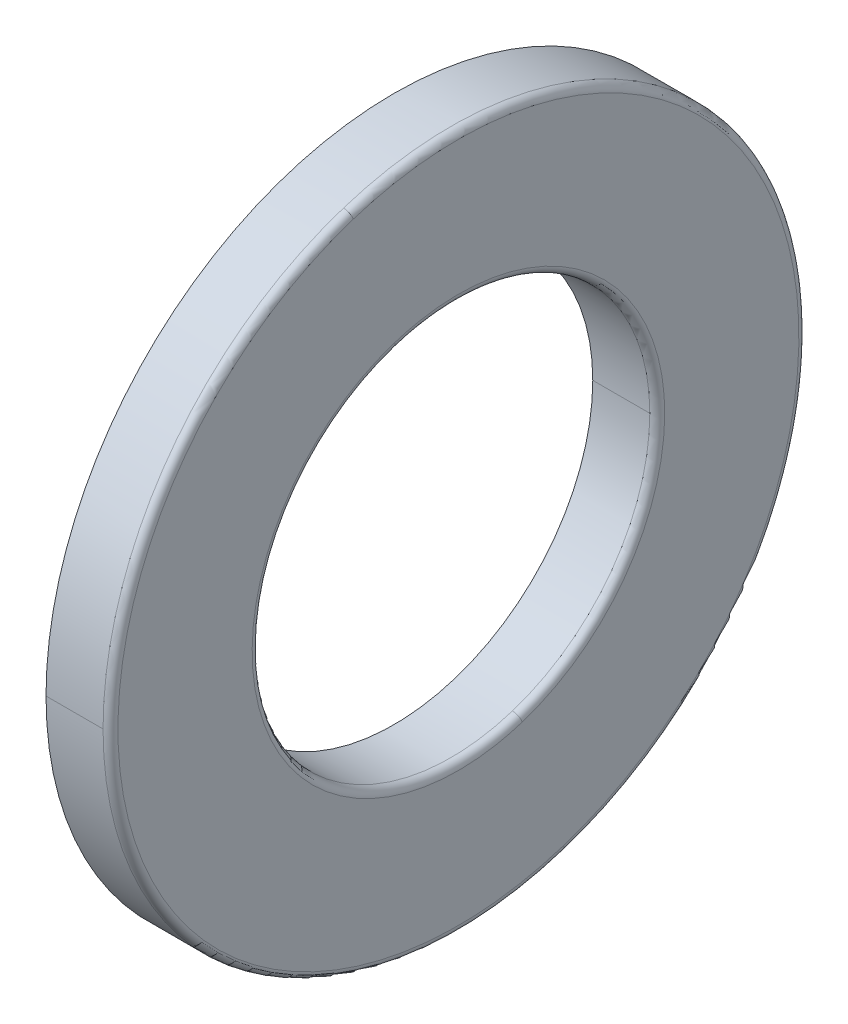
ISO-10303-21;
HEADER;
FILE_DESCRIPTION(('STEP AP214'),'2;1');
FILE_NAME('part.step','',(''),(''),'','','');
FILE_SCHEMA(('AUTOMOTIVE_DESIGN { 1 0 10303 214 1 1 1 1 }'));
ENDSEC;
DATA;
#1=APPLICATION_CONTEXT('core data for automotive mechanical design processes');
#2=APPLICATION_PROTOCOL_DEFINITION('international standard','automotive_design',2000,#1);
#3=PRODUCT_CONTEXT('',#1,'mechanical');
#4=PRODUCT('Part','Part','',(#3));
#5=PRODUCT_RELATED_PRODUCT_CATEGORY('part','',(#4));
#6=PRODUCT_DEFINITION_FORMATION('','',#4);
#7=PRODUCT_DEFINITION_CONTEXT('part definition',#1,'design');
#8=PRODUCT_DEFINITION('design','',#6,#7);
#9=PRODUCT_DEFINITION_SHAPE('','',#8);
#10=(LENGTH_UNIT() NAMED_UNIT(*) SI_UNIT(.MILLI.,.METRE.));
#11=(NAMED_UNIT(*) PLANE_ANGLE_UNIT() SI_UNIT($,.RADIAN.));
#12=(NAMED_UNIT(*) SI_UNIT($,.STERADIAN.) SOLID_ANGLE_UNIT());
#13=UNCERTAINTY_MEASURE_WITH_UNIT(LENGTH_MEASURE(1.E-05),#10,'distance_accuracy_value','');
#14=(GEOMETRIC_REPRESENTATION_CONTEXT(3) GLOBAL_UNCERTAINTY_ASSIGNED_CONTEXT((#13)) GLOBAL_UNIT_ASSIGNED_CONTEXT((#10,
#11,#12)) REPRESENTATION_CONTEXT('',''));
#15=CARTESIAN_POINT('',(0.,0.,0.));
#16=DIRECTION('',(0.,0.,1.));
#17=DIRECTION('',(1.,0.,0.));
#18=AXIS2_PLACEMENT_3D('',#15,#16,#17);
#19=CARTESIAN_POINT('',(4.5,0.,0.));
#20=DIRECTION('',(1.,0.,0.));
#21=DIRECTION('',(0.,-0.309016994374947,0.951056516295154));
#22=AXIS2_PLACEMENT_3D('',#19,#20,#21);
#23=TOROIDAL_SURFACE('',#22,10.75,2.381);
#24=CARTESIAN_POINT('',(4.5,-10.2238575501729,-3.32193268953068));
#25=DIRECTION('',(0.,0.309016994374947,-0.951056516295154));
#26=DIRECTION('',(0.800000000000001,0.57063390977709,0.185410196624968));
#27=AXIS2_PLACEMENT_3D('',#24,#25,#26);
#28=CIRCLE('',#27,2.381);
#29=CARTESIAN_POINT('',(6.4048,-8.86517821099365,-2.88047101136663));
#30=VERTEX_POINT('',#29);
#31=CARTESIAN_POINT('',(6.4048,-11.5825368893522,-3.76339436769473));
#32=VERTEX_POINT('',#31);
#33=EDGE_CURVE('E11',#30,#32,#28,.T.);
#34=ORIENTED_EDGE('',*,*,#33,.F.);
#35=CARTESIAN_POINT('',(6.4048,0.,0.));
#36=DIRECTION('',(1.,0.,0.));
#37=DIRECTION('',(0.,-0.951056516295154,-0.309016994374947));
#38=AXIS2_PLACEMENT_3D('',#35,#36,#37);
#39=CIRCLE('',#38,9.3214);
#40=CARTESIAN_POINT('',(6.4048,8.86517821099365,2.88047101136664));
#41=VERTEX_POINT('',#40);
#42=EDGE_CURVE('E25',#30,#41,#39,.T.);
#43=ORIENTED_EDGE('',*,*,#42,.T.);
#44=CARTESIAN_POINT('',(4.5,10.2238575501729,3.32193268953068));
#45=DIRECTION('',(0.,-0.309016994374948,0.951056516295154));
#46=DIRECTION('',(0.800000000000001,-0.57063390977709,-0.185410196624968));
#47=AXIS2_PLACEMENT_3D('',#44,#45,#46);
#48=CIRCLE('',#47,2.381);
#49=CARTESIAN_POINT('',(6.4048,11.5825368893522,3.76339436769473));
#50=VERTEX_POINT('',#49);
#51=EDGE_CURVE('E327',#41,#50,#48,.T.);
#52=ORIENTED_EDGE('',*,*,#51,.T.);
#53=CARTESIAN_POINT('',(6.4048,0.,0.));
#54=DIRECTION('',(1.,0.,0.));
#55=DIRECTION('',(0.,-0.951056516295154,-0.309016994374947));
#56=AXIS2_PLACEMENT_3D('',#53,#54,#55);
#57=CIRCLE('',#56,12.1786);
#58=EDGE_CURVE('E323',#32,#50,#57,.T.);
#59=ORIENTED_EDGE('',*,*,#58,.F.);
#60=EDGE_LOOP('',(#34,#43,#52,#59));
#61=FACE_BOUND('',#60,.T.);
#62=ADVANCED_FACE('F17',(#61),#23,.F.);
#63=CARTESIAN_POINT('',(6.4048,14.,0.));
#64=DIRECTION('',(-1.,0.,0.));
#65=DIRECTION('',(0.,0.,1.));
#66=AXIS2_PLACEMENT_3D('',#63,#64,#65);
#67=PLANE('',#66);
#68=ORIENTED_EDGE('',*,*,#58,.T.);
#69=CARTESIAN_POINT('',(6.4048,0.,0.));
#70=DIRECTION('',(1.,0.,0.));
#71=DIRECTION('',(0.,0.,-1.));
#72=AXIS2_PLACEMENT_3D('',#69,#70,#71);
#73=CIRCLE('',#72,12.1786);
#74=EDGE_CURVE('E318',#50,#32,#73,.T.);
#75=ORIENTED_EDGE('',*,*,#74,.T.);
#76=EDGE_LOOP('',(#68,#75));
#77=FACE_BOUND('',#76,.T.);
#78=CARTESIAN_POINT('',(6.4048,0.,0.));
#79=DIRECTION('',(1.,0.,0.));
#80=DIRECTION('',(0.,0.,-1.));
#81=AXIS2_PLACEMENT_3D('',#78,#79,#80);
#82=CIRCLE('',#81,14.);
#83=CARTESIAN_POINT('',(6.4048,0.,14.));
#84=VERTEX_POINT('',#83);
#85=CARTESIAN_POINT('',(6.4048,0.,-14.));
#86=VERTEX_POINT('',#85);
#87=EDGE_CURVE('E313',#84,#86,#82,.T.);
#88=ORIENTED_EDGE('',*,*,#87,.F.);
#89=CARTESIAN_POINT('',(6.4048,0.,0.));
#90=DIRECTION('',(1.,0.,0.));
#91=DIRECTION('',(0.,0.,-1.));
#92=AXIS2_PLACEMENT_3D('',#89,#90,#91);
#93=CIRCLE('',#92,14.);
#94=EDGE_CURVE('E308',#86,#84,#93,.T.);
#95=ORIENTED_EDGE('',*,*,#94,.F.);
#96=EDGE_LOOP('',(#88,#95));
#97=FACE_BOUND('',#96,.T.);
#98=ADVANCED_FACE('F233',(#77,#97),#67,.T.);
#99=CARTESIAN_POINT('',(8.7,0.,0.));
#100=DIRECTION('',(1.,0.,0.));
#101=DIRECTION('',(0.,-1.,0.));
#102=AXIS2_PLACEMENT_3D('',#99,#100,#101);
#103=CYLINDRICAL_SURFACE('',#102,14.);
#104=DIRECTION('',(1.,0.,0.));
#105=VECTOR('',#104,1.);
#106=CARTESIAN_POINT('',(6.4048,0.,14.));
#107=LINE('',#106,#105);
#108=CARTESIAN_POINT('',(8.7,0.,14.));
#109=VERTEX_POINT('',#108);
#110=EDGE_CURVE('E304',#84,#109,#107,.T.);
#111=ORIENTED_EDGE('',*,*,#110,.T.);
#112=CARTESIAN_POINT('',(8.7,0.,0.));
#113=DIRECTION('',(1.,0.,0.));
#114=DIRECTION('',(0.,0.,-1.));
#115=AXIS2_PLACEMENT_3D('',#112,#113,#114);
#116=CIRCLE('',#115,14.);
#117=CARTESIAN_POINT('',(8.7,13.3147912281321,4.32623792124926));
#118=VERTEX_POINT('',#117);
#119=EDGE_CURVE('E300',#118,#109,#116,.T.);
#120=ORIENTED_EDGE('',*,*,#119,.F.);
#121=CARTESIAN_POINT('',(8.7,0.,0.));
#122=DIRECTION('',(1.,0.,0.));
#123=DIRECTION('',(0.,0.,-1.));
#124=AXIS2_PLACEMENT_3D('',#121,#122,#123);
#125=CIRCLE('',#124,14.);
#126=CARTESIAN_POINT('',(8.7,0.,-14.));
#127=VERTEX_POINT('',#126);
#128=EDGE_CURVE('E296',#127,#118,#125,.T.);
#129=ORIENTED_EDGE('',*,*,#128,.F.);
#130=DIRECTION('',(1.,0.,0.));
#131=VECTOR('',#130,1.);
#132=CARTESIAN_POINT('',(6.4048,0.,-14.));
#133=LINE('',#132,#131);
#134=EDGE_CURVE('E291',#86,#127,#133,.T.);
#135=ORIENTED_EDGE('',*,*,#134,.F.);
#136=ORIENTED_EDGE('',*,*,#94,.T.);
#137=EDGE_LOOP('',(#111,#120,#129,#135,#136));
#138=FACE_BOUND('',#137,.T.);
#139=ADVANCED_FACE('F237',(#138),#103,.T.);
#140=CARTESIAN_POINT('',(8.7,0.,0.));
#141=DIRECTION('',(1.,0.,0.));
#142=DIRECTION('',(0.,1.,0.));
#143=AXIS2_PLACEMENT_3D('',#140,#141,#142);
#144=CYLINDRICAL_SURFACE('',#143,14.);
#145=ORIENTED_EDGE('',*,*,#110,.F.);
#146=ORIENTED_EDGE('',*,*,#87,.T.);
#147=ORIENTED_EDGE('',*,*,#134,.T.);
#148=CARTESIAN_POINT('',(8.7,0.,0.));
#149=DIRECTION('',(1.,0.,0.));
#150=DIRECTION('',(0.,0.,-1.));
#151=AXIS2_PLACEMENT_3D('',#148,#149,#150);
#152=CIRCLE('',#151,14.);
#153=CARTESIAN_POINT('',(8.7,-13.3147912281321,-4.32623792124926));
#154=VERTEX_POINT('',#153);
#155=EDGE_CURVE('E287',#154,#127,#152,.T.);
#156=ORIENTED_EDGE('',*,*,#155,.F.);
#157=CARTESIAN_POINT('',(8.7,0.,0.));
#158=DIRECTION('',(1.,0.,0.));
#159=DIRECTION('',(0.,0.,-1.));
#160=AXIS2_PLACEMENT_3D('',#157,#158,#159);
#161=CIRCLE('',#160,14.);
#162=EDGE_CURVE('E266',#109,#154,#161,.T.);
#163=ORIENTED_EDGE('',*,*,#162,.F.);
#164=EDGE_LOOP('',(#145,#146,#147,#156,#163));
#165=FACE_BOUND('',#164,.T.);
#166=ADVANCED_FACE('F242',(#165),#144,.T.);
#167=CARTESIAN_POINT('',(8.70000000000012,0.,0.));
#168=DIRECTION('',(1.,0.,0.));
#169=DIRECTION('',(0.,0.309016994374947,-0.951056516295154));
#170=AXIS2_PLACEMENT_3D('',#167,#168,#169);
#171=TOROIDAL_SURFACE('',#170,13.7000000000001,0.299999999999878);
#172=CARTESIAN_POINT('',(8.70000000000012,-13.0294742732437,-4.23353282293681));
#173=DIRECTION('',(0.,0.309016994374947,-0.951056516295154));
#174=DIRECTION('',(1.,0.,0.));
#175=AXIS2_PLACEMENT_3D('',#172,#173,#174);
#176=CIRCLE('',#175,0.299999999999878);
#177=CARTESIAN_POINT('',(9.,-13.0294742732437,-4.23353282293681));
#178=VERTEX_POINT('',#177);
#179=EDGE_CURVE('E259',#178,#154,#176,.T.);
#180=ORIENTED_EDGE('',*,*,#179,.F.);
#181=CARTESIAN_POINT('',(9.,0.,0.));
#182=DIRECTION('',(1.,0.,0.));
#183=DIRECTION('',(0.,0.,-1.));
#184=AXIS2_PLACEMENT_3D('',#181,#182,#183);
#185=CIRCLE('',#184,13.7);
#186=CARTESIAN_POINT('',(9.,13.0294742732437,4.23353282293682));
#187=VERTEX_POINT('',#186);
#188=EDGE_CURVE('E262',#187,#178,#185,.T.);
#189=ORIENTED_EDGE('',*,*,#188,.F.);
#190=CARTESIAN_POINT('',(8.70000000000012,13.0294742732437,4.23353282293682));
#191=DIRECTION('',(0.,-0.309016994374947,0.951056516295154));
#192=DIRECTION('',(1.,0.,0.));
#193=AXIS2_PLACEMENT_3D('',#190,#191,#192);
#194=CIRCLE('',#193,0.299999999999878);
#195=EDGE_CURVE('E271',#187,#118,#194,.T.);
#196=ORIENTED_EDGE('',*,*,#195,.T.);
#197=ORIENTED_EDGE('',*,*,#119,.T.);
#198=ORIENTED_EDGE('',*,*,#162,.T.);
#199=EDGE_LOOP('',(#180,#189,#196,#197,#198));
#200=FACE_BOUND('',#199,.T.);
#201=ADVANCED_FACE('F249',(#200),#171,.T.);
#202=CARTESIAN_POINT('',(8.70000000000012,0.,0.));
#203=DIRECTION('',(1.,0.,0.));
#204=DIRECTION('',(0.,-0.309016994374947,0.951056516295154));
#205=AXIS2_PLACEMENT_3D('',#202,#203,#204);
#206=TOROIDAL_SURFACE('',#205,13.7000000000001,0.299999999999878);
#207=ORIENTED_EDGE('',*,*,#179,.T.);
#208=ORIENTED_EDGE('',*,*,#155,.T.);
#209=ORIENTED_EDGE('',*,*,#128,.T.);
#210=ORIENTED_EDGE('',*,*,#195,.F.);
#211=CARTESIAN_POINT('',(9.,-13.0294742732436,-4.23353282293678));
#212=CARTESIAN_POINT('',(9.,-12.364445482672,-6.28017870572112));
#213=CARTESIAN_POINT('',(9.,-11.2977242279673,-8.19637060986403));
#214=CARTESIAN_POINT('',(9.,-9.86276560883806,-9.87640074180395));
#215=CARTESIAN_POINT('',(9.,-6.41146238160593,-12.5831986250358));
#216=CARTESIAN_POINT('',(9.,-2.19298901367726,-13.7843595336471));
#217=CARTESIAN_POINT('',(9.,0.00964202154805742,-13.9577141116845));
#218=CARTESIAN_POINT('',(9.,4.36407565946443,-13.431243812121));
#219=CARTESIAN_POINT('',(9.,8.19633795127018,-11.297695357048));
#220=CARTESIAN_POINT('',(9.,9.87640862671735,-9.86277451861592));
#221=CARTESIAN_POINT('',(9.,12.5832006039778,-6.41145849771348));
#222=CARTESIAN_POINT('',(9.,13.7843476908496,-2.19298787168432));
#223=CARTESIAN_POINT('',(9.,13.9577566649887,0.00963257009115726));
#224=CARTESIAN_POINT('',(9.,13.6944429464883,2.18686740684885));
#225=CARTESIAN_POINT('',(9.,13.0294742732436,4.23353282293678));
#226=B_SPLINE_CURVE_WITH_KNOTS('',5,(#211,#212,#213,#214,#215,#216,#217,#218,#219,#220,#221,
#222,#223,#224,#225),.UNSPECIFIED.,.F.,.F.,(6,3,3,3,6),(0.,0.785398163397448,1.5707963267949,
2.35619449019234,3.14159265358979),.UNSPECIFIED.);
#227=EDGE_CURVE('E205',#178,#187,#226,.T.);
#228=ORIENTED_EDGE('',*,*,#227,.F.);
#229=EDGE_LOOP('',(#207,#208,#209,#210,#228));
#230=FACE_BOUND('',#229,.T.);
#231=ADVANCED_FACE('F167',(#230),#206,.T.);
#232=CARTESIAN_POINT('',(9.,8.3,0.));
#233=DIRECTION('',(1.,0.,0.));
#234=DIRECTION('',(0.,0.,-1.));
#235=AXIS2_PLACEMENT_3D('',#232,#233,#234);
#236=PLANE('',#235);
#237=ORIENTED_EDGE('',*,*,#227,.T.);
#238=ORIENTED_EDGE('',*,*,#188,.T.);
#239=EDGE_LOOP('',(#237,#238));
#240=FACE_BOUND('',#239,.T.);
#241=CARTESIAN_POINT('',(9.,7.89376908524966,2.56484105331204));
#242=CARTESIAN_POINT('',(9.,7.85180466911084,2.69400356859346));
#243=CARTESIAN_POINT('',(9.,7.80666484656175,2.82213407404268));
#244=CARTESIAN_POINT('',(9.,7.71015497178767,3.07602688721217));
#245=CARTESIAN_POINT('',(9.,7.6587849195627,3.20178919493246));
#246=CARTESIAN_POINT('',(9.,7.54993516858153,3.45064143457961));
#247=CARTESIAN_POINT('',(9.,7.49245546982535,3.57373136650647));
#248=CARTESIAN_POINT('',(9.,7.3715257492948,3.81694264319222));
#249=CARTESIAN_POINT('',(9.,7.30807572752043,3.93706398795111));
#250=CARTESIAN_POINT('',(9.,7.17535798988778,4.17404862089825));
#251=CARTESIAN_POINT('',(9.,7.1060902740295,4.2909119090865));
#252=CARTESIAN_POINT('',(9.,6.96190408124258,4.52109891818925));
#253=CARTESIAN_POINT('',(9.,6.88698560431395,4.63442263910376));
#254=CARTESIAN_POINT('',(9.,6.73167835820937,4.85725750067449));
#255=CARTESIAN_POINT('',(9.,6.65128958903342,4.96676864133072));
#256=CARTESIAN_POINT('',(9.,6.48523542640134,5.1817145221203));
#257=CARTESIAN_POINT('',(9.,6.3995700329452,5.28714926225365));
#258=CARTESIAN_POINT('',(9.,6.22316899601511,5.49368834002727));
#259=CARTESIAN_POINT('',(9.,6.13243335254116,5.59479267766754));
#260=CARTESIAN_POINT('',(9.,5.9461104060026,5.79242738136951));
#261=CARTESIAN_POINT('',(9.,5.85052310293799,5.88895774743121));
#262=CARTESIAN_POINT('',(9.,5.65472711531939,6.07721195783709));
#263=CARTESIAN_POINT('',(9.,5.55451843076539,6.16893580218127));
#264=CARTESIAN_POINT('',(9.,5.34972109168892,6.3473559983856));
#265=CARTESIAN_POINT('',(9.,5.24513243716645,6.43405235024576));
#266=CARTESIAN_POINT('',(9.,5.03182712137662,6.60220870237443));
#267=CARTESIAN_POINT('',(9.,4.92311046010926,6.68366870264294));
#268=CARTESIAN_POINT('',(9.,4.70181103879071,6.84115610731321));
#269=CARTESIAN_POINT('',(9.,4.58922827873952,6.91718351171498));
#270=CARTESIAN_POINT('',(9.,4.36046788158294,7.06362256797519));
#271=CARTESIAN_POINT('',(9.,4.24429024447754,7.13403421983364));
#272=CARTESIAN_POINT('',(9.,4.00861997531639,7.26907214317059));
#273=CARTESIAN_POINT('',(9.,3.88912734326064,7.33369841464911));
#274=CARTESIAN_POINT('',(9.,3.64711495241571,7.4570098868776));
#275=CARTESIAN_POINT('',(9.,3.52459519362652,7.51569508762757));
#276=CARTESIAN_POINT('',(9.,3.27682371014511,7.62698304061018));
#277=CARTESIAN_POINT('',(9.,3.15157198545287,7.67958579284281));
#278=CARTESIAN_POINT('',(9.,2.89863831254091,7.77858212415312));
#279=CARTESIAN_POINT('',(9.,2.77095636432117,7.82497570323081));
#280=CARTESIAN_POINT('',(9.,2.51346984135106,7.91144192203565));
#281=CARTESIAN_POINT('',(9.,2.3836652666007,7.9515145617628));
#282=CARTESIAN_POINT('',(9.,2.12224620115945,8.02524236336752));
#283=CARTESIAN_POINT('',(9.,1.99063171046857,8.05889752524509));
#284=CARTESIAN_POINT('',(9.,1.72590988398243,8.11970929291783));
#285=CARTESIAN_POINT('',(9.,1.59280254818718,8.14686589871301));
#286=CARTESIAN_POINT('',(9.,1.32541569872305,8.19461513157897));
#287=CARTESIAN_POINT('',(9.,1.19113618505417,8.21520775864975));
#288=CARTESIAN_POINT('',(9.,0.921728470952734,8.24977942462461));
#289=CARTESIAN_POINT('',(9.,0.786600270520169,8.26375846352869));
#290=CARTESIAN_POINT('',(9.,0.515820718562019,8.285069276441));
#291=CARTESIAN_POINT('',(9.,0.380169367036435,8.29240105044923));
#292=CARTESIAN_POINT('',(9.,0.10867030887973,8.30039967068408));
#293=CARTESIAN_POINT('',(9.,-0.0271773977513924,8.3010665169107));
#294=CARTESIAN_POINT('',(9.,-0.298741897095047,8.29573367509134));
#295=CARTESIAN_POINT('',(9.,-0.434458689807579,8.28973398704537));
#296=CARTESIAN_POINT('',(9.,-0.705434407673021,8.27108253045485));
#297=CARTESIAN_POINT('',(9.,-0.840693332825931,8.25843076191031));
#298=CARTESIAN_POINT('',(9.,-1.11042746497415,8.22650562354123));
#299=CARTESIAN_POINT('',(9.,-1.24490267196947,8.2072322537167));
#300=CARTESIAN_POINT('',(9.,-1.51274540525021,8.16211034402371));
#301=CARTESIAN_POINT('',(9.,-1.64611293153563,8.13626180415525));
#302=CARTESIAN_POINT('',(9.,-1.91141900934417,8.078051825771));
#303=CARTESIAN_POINT('',(9.,-2.04335756086727,8.04569038725522));
#304=CARTESIAN_POINT('',(9.,-2.30548783762408,7.97453257311624));
#305=CARTESIAN_POINT('',(9.,-2.43567956285779,7.93573619749304));
#306=CARTESIAN_POINT('',(9.,-2.69400254376627,7.85180197300628));
#307=CARTESIAN_POINT('',(9.,-2.82213379944105,7.80666412414271));
#308=CARTESIAN_POINT('',(9.,-3.07602716181378,7.71015569420672));
#309=CARTESIAN_POINT('',(9.,-3.20178926851173,7.6587851131343));
#310=CARTESIAN_POINT('',(9.,-3.45064136100032,7.54993497500994));
#311=CARTESIAN_POINT('',(9.,-3.57373134679095,7.492455417958));
#312=CARTESIAN_POINT('',(9.,-3.81694266290772,7.37152580116216));
#313=CARTESIAN_POINT('',(9.,-3.93706399323385,7.30807574141825));
#314=CARTESIAN_POINT('',(9.,-4.17404861561548,7.17535797598997));
#315=CARTESIAN_POINT('',(9.,-4.29091190767098,7.1060902703056));
#316=CARTESIAN_POINT('',(9.,-4.52109891960475,6.9619040849665));
#317=CARTESIAN_POINT('',(9.,-4.63442263948303,6.88698560531178));
#318=CARTESIAN_POINT('',(9.,-4.8572575002952,6.73167835721156));
#319=CARTESIAN_POINT('',(9.,-4.96676864122909,6.65128958876606));
#320=CARTESIAN_POINT('',(9.,-5.18171452222192,6.48523542666871));
#321=CARTESIAN_POINT('',(9.,-5.28714926228087,6.39957003301685));
#322=CARTESIAN_POINT('',(9.,-5.49368834000003,6.22316899594348));
#323=CARTESIAN_POINT('',(9.,-5.59479267766024,6.13243335252197));
#324=CARTESIAN_POINT('',(9.,-5.7924273813768,5.9461104060218));
#325=CARTESIAN_POINT('',(9.,-5.88895774743316,5.85052310294314));
#326=CARTESIAN_POINT('',(9.,-6.07721195783512,5.65472711531425));
#327=CARTESIAN_POINT('',(9.,-6.16893580218073,5.55451843076402));
#328=CARTESIAN_POINT('',(9.,-6.34735599838612,5.34972109169031));
#329=CARTESIAN_POINT('',(9.,-6.4340523502459,5.24513243716684));
#330=CARTESIAN_POINT('',(9.,-6.60220870237428,5.03182712137627));
#331=CARTESIAN_POINT('',(9.,-6.68366870264289,4.92311046010917));
#332=CARTESIAN_POINT('',(9.,-6.84115610731324,4.70181103879082));
#333=CARTESIAN_POINT('',(9.,-6.91718351171498,4.58922827873956));
#334=CARTESIAN_POINT('',(9.,-7.06362256797517,4.36046788158292));
#335=CARTESIAN_POINT('',(9.,-7.13403421983363,4.24429024447754));
#336=CARTESIAN_POINT('',(9.,-7.26907214317059,4.00861997531641));
#337=CARTESIAN_POINT('',(9.,-7.33369841464911,3.88912734326065));
#338=CARTESIAN_POINT('',(9.,-7.45700988687759,3.64711495241572));
#339=CARTESIAN_POINT('',(9.,-7.51569508762756,3.52459519362653));
#340=CARTESIAN_POINT('',(9.,-7.62698304061018,3.27682371014512));
#341=CARTESIAN_POINT('',(9.,-7.67958579284283,3.15157198545288));
#342=CARTESIAN_POINT('',(9.,-7.77858212415309,2.89863831254093));
#343=CARTESIAN_POINT('',(9.,-7.8249757032307,2.77095636432121));
#344=CARTESIAN_POINT('',(9.,-7.91144192203575,2.51346984135105));
#345=CARTESIAN_POINT('',(9.,-7.95151456176318,2.38366526660061));
#346=CARTESIAN_POINT('',(9.,-8.02524236336714,2.12224620115956));
#347=CARTESIAN_POINT('',(9.,-8.05889752524366,1.99063171046897));
#348=CARTESIAN_POINT('',(9.,-8.11970929291925,1.72590988398206));
#349=CARTESIAN_POINT('',(9.,-8.14686589871831,1.59280254818575));
#350=CARTESIAN_POINT('',(9.,-8.19461513157365,1.3254156987245));
#351=CARTESIAN_POINT('',(9.,-8.21520775862993,1.19113618505957));
#352=CARTESIAN_POINT('',(9.,-8.24977942464443,0.921728470947369));
#353=CARTESIAN_POINT('',(9.,-8.26375846360265,0.786600270500105));
#354=CARTESIAN_POINT('',(9.,-8.28506927636704,0.515820718582113));
#355=CARTESIAN_POINT('',(9.,-8.29240105017319,0.380169367111384));
#356=CARTESIAN_POINT('',(9.,-8.30039967096012,0.108670308804811));
#357=CARTESIAN_POINT('',(9.,-8.30106651794089,-0.0271773980310325));
#358=CARTESIAN_POINT('',(9.,-8.29573367406115,-0.298741896815376));
#359=CARTESIAN_POINT('',(9.,-8.28973398320065,-0.434458688763876));
#360=CARTESIAN_POINT('',(9.,-8.27108253429957,-0.705434408716695));
#361=CARTESIAN_POINT('',(9.,-8.258430776259,-0.840693336721013));
#362=CARTESIAN_POINT('',(9.,-8.22650560919254,-1.11042746107905));
#363=CARTESIAN_POINT('',(9.,-8.20723220016665,-1.24490265743278));
#364=CARTESIAN_POINT('',(9.,-8.16211039757377,-1.51274541978688));
#365=CARTESIAN_POINT('',(9.,-8.13626200400678,-1.64611298578727));
#366=CARTESIAN_POINT('',(9.,-8.07805162591947,-1.91141895509251));
#367=CARTESIAN_POINT('',(9.,-8.04568964139916,-2.04335735839737));
#368=CARTESIAN_POINT('',(9.,-7.9745333189723,-2.30548804009395));
#369=CARTESIAN_POINT('',(9.,-7.93573898106576,-2.43568031848567));
#370=CARTESIAN_POINT('',(9.,-7.89376908524966,-2.56484105331202));
#371=B_SPLINE_CURVE_WITH_KNOTS('',3,(#241,#242,#243,#244,#245,#246,#247,#248,#249,#250,#251,
#252,#253,#254,#255,#256,#257,#258,#259,#260,#261,#262,#263,#264,#265,#266,#267,#268,#269,#270,
#271,#272,#273,#274,#275,#276,#277,#278,#279,#280,#281,#282,#283,#284,#285,#286,#287,#288,#289,
#290,#291,#292,#293,#294,#295,#296,#297,#298,#299,#300,#301,#302,#303,#304,#305,#306,#307,#308,
#309,#310,#311,#312,#313,#314,#315,#316,#317,#318,#319,#320,#321,#322,#323,#324,#325,#326,#327,
#328,#329,#330,#331,#332,#333,#334,#335,#336,#337,#338,#339,#340,#341,#342,#343,#344,#345,#346,
#347,#348,#349,#350,#351,#352,#353,#354,#355,#356,#357,#358,#359,#360,#361,#362,#363,#364,#365,
#366,#367,#368,#369,#370),.UNSPECIFIED.,.F.,.F.,(4,2,2,2,2,2,2,2,2,2,2,2,2,2,2,2,2,2,2,2,2,2,2,
2,2,2,2,2,2,2,2,2,2,2,2,2,2,2,2,2,2,2,2,2,2,2,2,2,2,2,2,2,2,2,2,2,2,2,2,2,2,2,2,2,4),(0.,
0.407384393480336,0.814768786960675,1.22215318044101,1.62953757392135,2.03692196740169,
2.44430636088203,2.85169075436236,3.2590751478427,3.66645954132304,4.07384393480338,
4.48122832828372,4.88861272176405,5.29599711524439,5.70338150872473,6.11076590220506,
6.5181502956854,6.92553468916574,7.33291908264608,7.74030347612642,8.14768786960676,
8.55507226308709,8.96245665656744,9.36984105004777,9.77722544352811,10.1846098370084,
10.5919942304888,10.9993786239691,11.4067630174495,11.8141474109298,12.2215318044101,
12.6289161978905,13.0363005913708,13.4436849848511,13.8510693783315,14.2584537718118,
14.6658381652922,15.0732225587725,15.4806069522528,15.8879913457332,16.2953757392135,
16.7027601326939,17.1101445261742,17.5175289196545,17.9249133131349,18.3322977066152,
18.7396821000955,19.1470664935759,19.5544508870562,19.9618352805365,20.3692196740169,
20.7766040674972,21.1839884609776,21.5913728544579,21.9987572479382,22.4061416414186,
22.8135260348989,23.2209104283792,23.6282948218596,24.0356792153399,24.4430636088203,
24.8504480023006,25.2578323957809,25.6652167892613,26.0726011827416),.UNSPECIFIED.);
#372=CARTESIAN_POINT('',(9.,7.89376908524966,2.56484105331203));
#373=VERTEX_POINT('',#372);
#374=CARTESIAN_POINT('',(9.,-7.89376908524966,-2.56484105331202));
#375=VERTEX_POINT('',#374);
#376=EDGE_CURVE('E201',#373,#375,#371,.T.);
#377=ORIENTED_EDGE('',*,*,#376,.F.);
#378=CARTESIAN_POINT('',(9.,-7.89376908524966,-2.56484105331204));
#379=CARTESIAN_POINT('',(9.,-7.85180466911084,-2.69400356859346));
#380=CARTESIAN_POINT('',(9.,-7.80666484656175,-2.82213407404267));
#381=CARTESIAN_POINT('',(9.,-7.71015497178767,-3.07602688721217));
#382=CARTESIAN_POINT('',(9.,-7.6587849195627,-3.20178919493246));
#383=CARTESIAN_POINT('',(9.,-7.54993516858153,-3.45064143457961));
#384=CARTESIAN_POINT('',(9.,-7.49245546982535,-3.57373136650647));
#385=CARTESIAN_POINT('',(9.,-7.3715257492948,-3.81694264319222));
#386=CARTESIAN_POINT('',(9.,-7.30807572752043,-3.93706398795111));
#387=CARTESIAN_POINT('',(9.,-7.17535798988778,-4.17404862089825));
#388=CARTESIAN_POINT('',(9.,-7.1060902740295,-4.2909119090865));
#389=CARTESIAN_POINT('',(9.,-6.96190408124258,-4.52109891818925));
#390=CARTESIAN_POINT('',(9.,-6.88698560431395,-4.63442263910375));
#391=CARTESIAN_POINT('',(9.,-6.73167835820937,-4.85725750067449));
#392=CARTESIAN_POINT('',(9.,-6.65128958903342,-4.96676864133072));
#393=CARTESIAN_POINT('',(9.,-6.48523542640134,-5.1817145221203));
#394=CARTESIAN_POINT('',(9.,-6.39957003294521,-5.28714926225364));
#395=CARTESIAN_POINT('',(9.,-6.22316899601512,-5.49368834002726));
#396=CARTESIAN_POINT('',(9.,-6.13243335254116,-5.59479267766754));
#397=CARTESIAN_POINT('',(9.,-5.9461104060026,-5.79242738136951));
#398=CARTESIAN_POINT('',(9.,-5.85052310293799,-5.88895774743121));
#399=CARTESIAN_POINT('',(9.,-5.65472711531939,-6.07721195783708));
#400=CARTESIAN_POINT('',(9.,-5.55451843076539,-6.16893580218126));
#401=CARTESIAN_POINT('',(9.,-5.34972109168893,-6.3473559983856));
#402=CARTESIAN_POINT('',(9.,-5.24513243716646,-6.43405235024576));
#403=CARTESIAN_POINT('',(9.,-5.03182712137663,-6.60220870237443));
#404=CARTESIAN_POINT('',(9.,-4.92311046010926,-6.68366870264293));
#405=CARTESIAN_POINT('',(9.,-4.70181103879071,-6.8411561073132));
#406=CARTESIAN_POINT('',(9.,-4.58922827873953,-6.91718351171497));
#407=CARTESIAN_POINT('',(9.,-4.36046788158294,-7.06362256797519));
#408=CARTESIAN_POINT('',(9.,-4.24429024447754,-7.13403421983363));
#409=CARTESIAN_POINT('',(9.,-4.0086199753164,-7.26907214317059));
#410=CARTESIAN_POINT('',(9.,-3.88912734326065,-7.3336984146491));
#411=CARTESIAN_POINT('',(9.,-3.64711495241571,-7.45700988687759));
#412=CARTESIAN_POINT('',(9.,-3.52459519362653,-7.51569508762757));
#413=CARTESIAN_POINT('',(9.,-3.27682371014511,-7.62698304061018));
#414=CARTESIAN_POINT('',(9.,-3.15157198545288,-7.6795857928428));
#415=CARTESIAN_POINT('',(9.,-2.89863831254091,-7.77858212415312));
#416=CARTESIAN_POINT('',(9.,-2.77095636432117,-7.8249757032308));
#417=CARTESIAN_POINT('',(9.,-2.51346984135107,-7.91144192203565));
#418=CARTESIAN_POINT('',(9.,-2.38366526660071,-7.9515145617628));
#419=CARTESIAN_POINT('',(9.,-2.12224620115946,-8.02524236336752));
#420=CARTESIAN_POINT('',(9.,-1.99063171046858,-8.05889752524509));
#421=CARTESIAN_POINT('',(9.,-1.72590988398244,-8.11970929291783));
#422=CARTESIAN_POINT('',(9.,-1.59280254818719,-8.146865898713));
#423=CARTESIAN_POINT('',(9.,-1.32541569872306,-8.19461513157896));
#424=CARTESIAN_POINT('',(9.,-1.19113618505419,-8.21520775864975));
#425=CARTESIAN_POINT('',(9.,-0.921728470952748,-8.24977942462461));
#426=CARTESIAN_POINT('',(9.,-0.786600270520182,-8.26375846352869));
#427=CARTESIAN_POINT('',(9.,-0.51582071856203,-8.285069276441));
#428=CARTESIAN_POINT('',(9.,-0.380169367036445,-8.29240105044923));
#429=CARTESIAN_POINT('',(9.,-0.108670308879739,-8.30039967068408));
#430=CARTESIAN_POINT('',(9.,0.0271773977513821,-8.3010665169107));
#431=CARTESIAN_POINT('',(9.,0.298741897095036,-8.29573367509134));
#432=CARTESIAN_POINT('',(9.,0.434458689807569,-8.28973398704537));
#433=CARTESIAN_POINT('',(9.,0.705434407673011,-8.27108253045485));
#434=CARTESIAN_POINT('',(9.,0.840693332825921,-8.25843076191031));
#435=CARTESIAN_POINT('',(9.,1.11042746497414,-8.22650562354123));
#436=CARTESIAN_POINT('',(9.,1.24490267196946,-8.2072322537167));
#437=CARTESIAN_POINT('',(9.,1.5127454052502,-8.16211034402371));
#438=CARTESIAN_POINT('',(9.,1.64611293153562,-8.13626180415525));
#439=CARTESIAN_POINT('',(9.,1.91141900934415,-8.078051825771));
#440=CARTESIAN_POINT('',(9.,2.04335756086726,-8.04569038725522));
#441=CARTESIAN_POINT('',(9.,2.30548783762407,-7.97453257311624));
#442=CARTESIAN_POINT('',(9.,2.43567956285777,-7.93573619749305));
#443=CARTESIAN_POINT('',(9.,2.69400254376626,-7.85180197300628));
#444=CARTESIAN_POINT('',(9.,2.82213379944104,-7.80666412414271));
#445=CARTESIAN_POINT('',(9.,3.07602716181377,-7.71015569420672));
#446=CARTESIAN_POINT('',(9.,3.20178926851172,-7.6587851131343));
#447=CARTESIAN_POINT('',(9.,3.45064136100031,-7.54993497500994));
#448=CARTESIAN_POINT('',(9.,3.57373134679094,-7.492455417958));
#449=CARTESIAN_POINT('',(9.,3.81694266290771,-7.37152580116216));
#450=CARTESIAN_POINT('',(9.,3.93706399323384,-7.30807574141826));
#451=CARTESIAN_POINT('',(9.,4.17404861561547,-7.17535797598998));
#452=CARTESIAN_POINT('',(9.,4.29091190767097,-7.1060902703056));
#453=CARTESIAN_POINT('',(9.,4.52109891960474,-6.9619040849665));
#454=CARTESIAN_POINT('',(9.,4.63442263948302,-6.88698560531178));
#455=CARTESIAN_POINT('',(9.,4.85725750029519,-6.73167835721156));
#456=CARTESIAN_POINT('',(9.,4.96676864122908,-6.65128958876607));
#457=CARTESIAN_POINT('',(9.,5.18171452222191,-6.48523542666872));
#458=CARTESIAN_POINT('',(9.,5.28714926228086,-6.39957003301686));
#459=CARTESIAN_POINT('',(9.,5.49368834000001,-6.22316899594349));
#460=CARTESIAN_POINT('',(9.,5.59479267766022,-6.13243335252198));
#461=CARTESIAN_POINT('',(9.,5.79242738137679,-5.94611040602181));
#462=CARTESIAN_POINT('',(9.,5.88895774743315,-5.85052310294315));
#463=CARTESIAN_POINT('',(9.,6.07721195783511,-5.65472711531426));
#464=CARTESIAN_POINT('',(9.,6.16893580218072,-5.55451843076403));
#465=CARTESIAN_POINT('',(9.,6.34735599838611,-5.34972109169032));
#466=CARTESIAN_POINT('',(9.,6.43405235024589,-5.24513243716685));
#467=CARTESIAN_POINT('',(9.,6.60220870237427,-5.03182712137628));
#468=CARTESIAN_POINT('',(9.,6.68366870264288,-4.92311046010919));
#469=CARTESIAN_POINT('',(9.,6.84115610731323,-4.70181103879084));
#470=CARTESIAN_POINT('',(9.,6.91718351171497,-4.58922827873958));
#471=CARTESIAN_POINT('',(9.,7.06362256797516,-4.36046788158294));
#472=CARTESIAN_POINT('',(9.,7.13403421983362,-4.24429024447756));
#473=CARTESIAN_POINT('',(9.,7.26907214317058,-4.00861997531643));
#474=CARTESIAN_POINT('',(9.,7.33369841464909,-3.88912734326067));
#475=CARTESIAN_POINT('',(9.,7.45700988687758,-3.64711495241573));
#476=CARTESIAN_POINT('',(9.,7.51569508762755,-3.52459519362655));
#477=CARTESIAN_POINT('',(9.,7.62698304061018,-3.27682371014513));
#478=CARTESIAN_POINT('',(9.,7.67958579284282,-3.15157198545289));
#479=CARTESIAN_POINT('',(9.,7.77858212415308,-2.89863831254094));
#480=CARTESIAN_POINT('',(9.,7.82497570323069,-2.77095636432122));
#481=CARTESIAN_POINT('',(9.,7.91144192203574,-2.51346984135107));
#482=CARTESIAN_POINT('',(9.,7.95151456176317,-2.38366526660063));
#483=CARTESIAN_POINT('',(9.,8.02524236336713,-2.12224620115959));
#484=CARTESIAN_POINT('',(9.,8.05889752524366,-1.99063171046899));
#485=CARTESIAN_POINT('',(9.,8.11970929291924,-1.72590988398208));
#486=CARTESIAN_POINT('',(9.,8.14686589871831,-1.59280254818577));
#487=CARTESIAN_POINT('',(9.,8.19461513157365,-1.32541569872452));
#488=CARTESIAN_POINT('',(9.,8.21520775862992,-1.19113618505959));
#489=CARTESIAN_POINT('',(9.,8.24977942464443,-0.921728470947392));
#490=CARTESIAN_POINT('',(9.,8.26375846360265,-0.786600270500128));
#491=CARTESIAN_POINT('',(9.,8.28506927636703,-0.515820718582135));
#492=CARTESIAN_POINT('',(9.,8.29240105017319,-0.380169367111407));
#493=CARTESIAN_POINT('',(9.,8.30039967096012,-0.108670308804834));
#494=CARTESIAN_POINT('',(9.,8.30106651794089,0.0271773980310094));
#495=CARTESIAN_POINT('',(9.,8.29573367406115,0.298741896815353));
#496=CARTESIAN_POINT('',(9.,8.28973398320065,0.434458688763853));
#497=CARTESIAN_POINT('',(9.,8.27108253429958,0.705434408716672));
#498=CARTESIAN_POINT('',(9.,8.25843077625901,0.840693336720991));
#499=CARTESIAN_POINT('',(9.,8.22650560919254,1.11042746107903));
#500=CARTESIAN_POINT('',(9.,8.20723220016665,1.24490265743275));
#501=CARTESIAN_POINT('',(9.,8.16211039757377,1.51274541978686));
#502=CARTESIAN_POINT('',(9.,8.13626200400678,1.64611298578724));
#503=CARTESIAN_POINT('',(9.,8.07805162591948,1.91141895509249));
#504=CARTESIAN_POINT('',(9.,8.04568964139916,2.04335735839735));
#505=CARTESIAN_POINT('',(9.,7.97453331897231,2.30548804009393));
#506=CARTESIAN_POINT('',(9.,7.93573898106577,2.43568031848565));
#507=CARTESIAN_POINT('',(9.,7.89376908524967,2.564841053312));
#508=B_SPLINE_CURVE_WITH_KNOTS('',3,(#378,#379,#380,#381,#382,#383,#384,#385,#386,#387,#388,
#389,#390,#391,#392,#393,#394,#395,#396,#397,#398,#399,#400,#401,#402,#403,#404,#405,#406,#407,
#408,#409,#410,#411,#412,#413,#414,#415,#416,#417,#418,#419,#420,#421,#422,#423,#424,#425,#426,
#427,#428,#429,#430,#431,#432,#433,#434,#435,#436,#437,#438,#439,#440,#441,#442,#443,#444,#445,
#446,#447,#448,#449,#450,#451,#452,#453,#454,#455,#456,#457,#458,#459,#460,#461,#462,#463,#464,
#465,#466,#467,#468,#469,#470,#471,#472,#473,#474,#475,#476,#477,#478,#479,#480,#481,#482,#483,
#484,#485,#486,#487,#488,#489,#490,#491,#492,#493,#494,#495,#496,#497,#498,#499,#500,#501,#502,
#503,#504,#505,#506,#507),.UNSPECIFIED.,.F.,.F.,(4,2,2,2,2,2,2,2,2,2,2,2,2,2,2,2,2,2,2,2,2,2,2,
2,2,2,2,2,2,2,2,2,2,2,2,2,2,2,2,2,2,2,2,2,2,2,2,2,2,2,2,2,2,2,2,2,2,2,2,2,2,2,2,2,4),(0.,
0.407384393480336,0.814768786960675,1.22215318044101,1.62953757392135,2.03692196740169,
2.44430636088202,2.85169075436236,3.2590751478427,3.66645954132304,4.07384393480337,
4.48122832828371,4.88861272176405,5.29599711524439,5.70338150872472,6.11076590220506,
6.5181502956854,6.92553468916574,7.33291908264608,7.74030347612641,8.14768786960675,
8.55507226308709,8.96245665656742,9.36984105004776,9.7772254435281,10.1846098370084,
10.5919942304888,10.9993786239691,11.4067630174494,11.8141474109298,12.2215318044101,
12.6289161978905,13.0363005913708,13.4436849848511,13.8510693783315,14.2584537718118,
14.6658381652922,15.0732225587725,15.4806069522528,15.8879913457332,16.2953757392135,
16.7027601326938,17.1101445261742,17.5175289196545,17.9249133131348,18.3322977066152,
18.7396821000955,19.1470664935759,19.5544508870562,19.9618352805365,20.3692196740169,
20.7766040674972,21.1839884609775,21.5913728544579,21.9987572479382,22.4061416414186,
22.8135260348989,23.2209104283792,23.6282948218596,24.0356792153399,24.4430636088202,
24.8504480023006,25.2578323957809,25.6652167892612,26.0726011827416),.UNSPECIFIED.);
#509=EDGE_CURVE('E191',#375,#373,#508,.T.);
#510=ORIENTED_EDGE('',*,*,#509,.F.);
#511=EDGE_LOOP('',(#377,#510));
#512=FACE_BOUND('',#511,.T.);
#513=ADVANCED_FACE('F161',(#240,#512),#236,.T.);
#514=CARTESIAN_POINT('',(8.70000000000012,0.,0.));
#515=DIRECTION('',(1.,0.,0.));
#516=DIRECTION('',(0.,-0.309016994374947,0.951056516295154));
#517=AXIS2_PLACEMENT_3D('',#514,#515,#516);
#518=TOROIDAL_SURFACE('',#517,8.29999999999988,0.299999999999877);
#519=CARTESIAN_POINT('',(8.70000000000012,-7.89376908524966,-2.56484105331202));
#520=DIRECTION('',(0.,0.309016994374948,-0.951056516295154));
#521=DIRECTION('',(-4.02640883597556E-13,0.951056516295154,0.309016994374948));
#522=AXIS2_PLACEMENT_3D('',#519,#520,#521);
#523=CIRCLE('',#522,0.299999999999877);
#524=CARTESIAN_POINT('',(8.7,-7.60845213036123,-2.47213595499958));
#525=VERTEX_POINT('',#524);
#526=EDGE_CURVE('E142',#525,#375,#523,.T.);
#527=ORIENTED_EDGE('',*,*,#526,.T.);
#528=ORIENTED_EDGE('',*,*,#509,.T.);
#529=CARTESIAN_POINT('',(8.70000000000012,7.89376908524966,2.56484105331203));
#530=DIRECTION('',(0.,-0.309016994374948,0.951056516295154));
#531=DIRECTION('',(-4.02640883597556E-13,-0.951056516295154,-0.309016994374948));
#532=AXIS2_PLACEMENT_3D('',#529,#530,#531);
#533=CIRCLE('',#532,0.299999999999877);
#534=CARTESIAN_POINT('',(8.7,7.60845213036123,2.47213595499958));
#535=VERTEX_POINT('',#534);
#536=EDGE_CURVE('E137',#535,#373,#533,.T.);
#537=ORIENTED_EDGE('',*,*,#536,.F.);
#538=CARTESIAN_POINT('',(8.7,0.,0.));
#539=DIRECTION('',(1.,0.,0.));
#540=DIRECTION('',(0.,0.,-1.));
#541=AXIS2_PLACEMENT_3D('',#538,#539,#540);
#542=CIRCLE('',#541,8.);
#543=CARTESIAN_POINT('',(8.7,0.,-8.));
#544=VERTEX_POINT('',#543);
#545=EDGE_CURVE('E133',#544,#535,#542,.T.);
#546=ORIENTED_EDGE('',*,*,#545,.F.);
#547=CARTESIAN_POINT('',(8.7,0.,0.));
#548=DIRECTION('',(1.,0.,0.));
#549=DIRECTION('',(0.,0.,-1.));
#550=AXIS2_PLACEMENT_3D('',#547,#548,#549);
#551=CIRCLE('',#550,8.);
#552=EDGE_CURVE('E109',#525,#544,#551,.T.);
#553=ORIENTED_EDGE('',*,*,#552,.F.);
#554=EDGE_LOOP('',(#527,#528,#537,#546,#553));
#555=FACE_BOUND('',#554,.T.);
#556=ADVANCED_FACE('F151',(#555),#518,.T.);
#557=CARTESIAN_POINT('',(8.7,0.,0.));
#558=DIRECTION('',(1.,0.,0.));
#559=DIRECTION('',(0.,1.,0.));
#560=AXIS2_PLACEMENT_3D('',#557,#558,#559);
#561=CYLINDRICAL_SURFACE('',#560,8.);
#562=DIRECTION('',(1.,0.,0.));
#563=VECTOR('',#562,1.);
#564=CARTESIAN_POINT('',(6.4048,0.,8.));
#565=LINE('',#564,#563);
#566=CARTESIAN_POINT('',(6.4048,0.,8.));
#567=VERTEX_POINT('',#566);
#568=CARTESIAN_POINT('',(8.7,0.,8.));
#569=VERTEX_POINT('',#568);
#570=EDGE_CURVE('E93',#567,#569,#565,.T.);
#571=ORIENTED_EDGE('',*,*,#570,.T.);
#572=CARTESIAN_POINT('',(8.7,0.,0.));
#573=DIRECTION('',(1.,0.,0.));
#574=DIRECTION('',(0.,0.,-1.));
#575=AXIS2_PLACEMENT_3D('',#572,#573,#574);
#576=CIRCLE('',#575,8.);
#577=EDGE_CURVE('E110',#569,#525,#576,.T.);
#578=ORIENTED_EDGE('',*,*,#577,.T.);
#579=ORIENTED_EDGE('',*,*,#552,.T.);
#580=DIRECTION('',(1.,0.,0.));
#581=VECTOR('',#580,1.);
#582=CARTESIAN_POINT('',(6.4048,0.,-8.));
#583=LINE('',#582,#581);
#584=CARTESIAN_POINT('',(6.4048,0.,-8.));
#585=VERTEX_POINT('',#584);
#586=EDGE_CURVE('E97',#585,#544,#583,.T.);
#587=ORIENTED_EDGE('',*,*,#586,.F.);
#588=CARTESIAN_POINT('',(6.4048,0.,0.));
#589=DIRECTION('',(1.,0.,0.));
#590=DIRECTION('',(0.,0.,-1.));
#591=AXIS2_PLACEMENT_3D('',#588,#589,#590);
#592=CIRCLE('',#591,8.);
#593=EDGE_CURVE('E89',#567,#585,#592,.T.);
#594=ORIENTED_EDGE('',*,*,#593,.F.);
#595=EDGE_LOOP('',(#571,#578,#579,#587,#594));
#596=FACE_BOUND('',#595,.T.);
#597=ADVANCED_FACE('F91',(#596),#561,.F.);
#598=CARTESIAN_POINT('',(6.4048,9.3214,0.));
#599=DIRECTION('',(-1.,0.,0.));
#600=DIRECTION('',(0.,0.,1.));
#601=AXIS2_PLACEMENT_3D('',#598,#599,#600);
#602=PLANE('',#601);
#603=CARTESIAN_POINT('',(6.4048,0.,0.));
#604=DIRECTION('',(1.,0.,0.));
#605=DIRECTION('',(0.,0.,-1.));
#606=AXIS2_PLACEMENT_3D('',#603,#604,#605);
#607=CIRCLE('',#606,8.);
#608=EDGE_CURVE('E101',#585,#567,#607,.T.);
#609=ORIENTED_EDGE('',*,*,#608,.T.);
#610=ORIENTED_EDGE('',*,*,#593,.T.);
#611=EDGE_LOOP('',(#609,#610));
#612=FACE_BOUND('',#611,.T.);
#613=ORIENTED_EDGE('',*,*,#42,.F.);
#614=CARTESIAN_POINT('',(6.4048,0.,0.));
#615=DIRECTION('',(1.,0.,0.));
#616=DIRECTION('',(0.,0.,-1.));
#617=AXIS2_PLACEMENT_3D('',#614,#615,#616);
#618=CIRCLE('',#617,9.3214);
#619=EDGE_CURVE('E114',#41,#30,#618,.T.);
#620=ORIENTED_EDGE('',*,*,#619,.F.);
#621=EDGE_LOOP('',(#613,#620));
#622=FACE_BOUND('',#621,.T.);
#623=ADVANCED_FACE('F112',(#612,#622),#602,.T.);
#624=CARTESIAN_POINT('',(4.5,0.,0.));
#625=DIRECTION('',(1.,0.,0.));
#626=DIRECTION('',(0.,0.309016994374947,-0.951056516295154));
#627=AXIS2_PLACEMENT_3D('',#624,#625,#626);
#628=TOROIDAL_SURFACE('',#627,10.75,2.381);
#629=ORIENTED_EDGE('',*,*,#33,.T.);
#630=ORIENTED_EDGE('',*,*,#74,.F.);
#631=ORIENTED_EDGE('',*,*,#51,.F.);
#632=ORIENTED_EDGE('',*,*,#619,.T.);
#633=EDGE_LOOP('',(#629,#630,#631,#632));
#634=FACE_BOUND('',#633,.T.);
#635=ADVANCED_FACE('F224',(#634),#628,.F.);
#636=CARTESIAN_POINT('',(8.7,0.,0.));
#637=DIRECTION('',(1.,0.,0.));
#638=DIRECTION('',(0.,-1.,0.));
#639=AXIS2_PLACEMENT_3D('',#636,#637,#638);
#640=CYLINDRICAL_SURFACE('',#639,8.);
#641=ORIENTED_EDGE('',*,*,#570,.F.);
#642=ORIENTED_EDGE('',*,*,#608,.F.);
#643=ORIENTED_EDGE('',*,*,#586,.T.);
#644=ORIENTED_EDGE('',*,*,#545,.T.);
#645=CARTESIAN_POINT('',(8.7,0.,0.));
#646=DIRECTION('',(1.,0.,0.));
#647=DIRECTION('',(0.,0.,-1.));
#648=AXIS2_PLACEMENT_3D('',#645,#646,#647);
#649=CIRCLE('',#648,8.);
#650=EDGE_CURVE('E107',#535,#569,#649,.T.);
#651=ORIENTED_EDGE('',*,*,#650,.T.);
#652=EDGE_LOOP('',(#641,#642,#643,#644,#651));
#653=FACE_BOUND('',#652,.T.);
#654=ADVANCED_FACE('F104',(#653),#640,.F.);
#655=CARTESIAN_POINT('',(8.70000000000012,0.,0.));
#656=DIRECTION('',(1.,0.,0.));
#657=DIRECTION('',(0.,0.309016994374947,-0.951056516295154));
#658=AXIS2_PLACEMENT_3D('',#655,#656,#657);
#659=TOROIDAL_SURFACE('',#658,8.29999999999988,0.299999999999877);
#660=ORIENTED_EDGE('',*,*,#526,.F.);
#661=ORIENTED_EDGE('',*,*,#577,.F.);
#662=ORIENTED_EDGE('',*,*,#650,.F.);
#663=ORIENTED_EDGE('',*,*,#536,.T.);
#664=ORIENTED_EDGE('',*,*,#376,.T.);
#665=EDGE_LOOP('',(#660,#661,#662,#663,#664));
#666=FACE_BOUND('',#665,.T.);
#667=ADVANCED_FACE('F206',(#666),#659,.T.);
#668=CLOSED_SHELL('',(#62,#98,#139,#166,#201,#231,#513,#556,#597,#623,#635,#654,#667));
#669=MANIFOLD_SOLID_BREP('B1',#668);
#670=ADVANCED_BREP_SHAPE_REPRESENTATION('',(#18,#669),#14);
#671=SHAPE_DEFINITION_REPRESENTATION(#9,#670);
ENDSEC;
END-ISO-10303-21;
